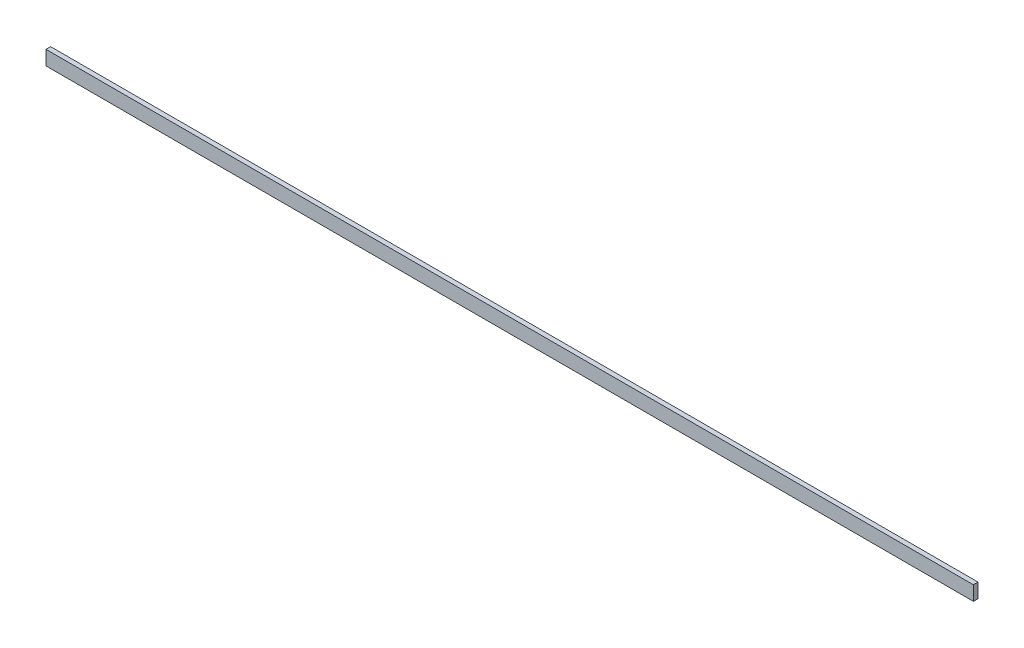
ISO-10303-21;
HEADER;
FILE_DESCRIPTION(('STEP AP214'),'2;1');
FILE_NAME('part.step','',(''),(''),'','','');
FILE_SCHEMA(('AUTOMOTIVE_DESIGN { 1 0 10303 214 1 1 1 1 }'));
ENDSEC;
DATA;
#1=APPLICATION_CONTEXT('core data for automotive mechanical design processes');
#2=APPLICATION_PROTOCOL_DEFINITION('international standard','automotive_design',2000,#1);
#3=PRODUCT_CONTEXT('',#1,'mechanical');
#4=PRODUCT('Part','Part','',(#3));
#5=PRODUCT_RELATED_PRODUCT_CATEGORY('part','',(#4));
#6=PRODUCT_DEFINITION_FORMATION('','',#4);
#7=PRODUCT_DEFINITION_CONTEXT('part definition',#1,'design');
#8=PRODUCT_DEFINITION('design','',#6,#7);
#9=PRODUCT_DEFINITION_SHAPE('','',#8);
#10=(LENGTH_UNIT() NAMED_UNIT(*) SI_UNIT(.MILLI.,.METRE.));
#11=(NAMED_UNIT(*) PLANE_ANGLE_UNIT() SI_UNIT($,.RADIAN.));
#12=(NAMED_UNIT(*) SI_UNIT($,.STERADIAN.) SOLID_ANGLE_UNIT());
#13=UNCERTAINTY_MEASURE_WITH_UNIT(LENGTH_MEASURE(1.E-05),#10,'distance_accuracy_value','');
#14=(GEOMETRIC_REPRESENTATION_CONTEXT(3) GLOBAL_UNCERTAINTY_ASSIGNED_CONTEXT((#13)) GLOBAL_UNIT_ASSIGNED_CONTEXT((#10,
#11,#12)) REPRESENTATION_CONTEXT('',''));
#15=CARTESIAN_POINT('',(0.,0.,0.));
#16=DIRECTION('',(0.,0.,1.));
#17=DIRECTION('',(1.,0.,0.));
#18=AXIS2_PLACEMENT_3D('',#15,#16,#17);
#19=CARTESIAN_POINT('',(-10.4952686825799,2.04431017119839,100.));
#20=DIRECTION('',(1.,0.,0.));
#21=DIRECTION('',(0.,1.,0.));
#22=AXIS2_PLACEMENT_3D('',#19,#20,#21);
#23=PLANE('',#22);
#24=DIRECTION('',(0.,-1.,0.));
#25=VECTOR('',#24,1.);
#26=CARTESIAN_POINT('',(-10.4952686825799,2.04431017119839,0.));
#27=LINE('',#26,#25);
#28=CARTESIAN_POINT('',(-10.4952686825799,2.04431017119839,0.));
#29=VERTEX_POINT('',#28);
#30=CARTESIAN_POINT('',(-10.4952686825798,-307.955689828802,0.));
#31=VERTEX_POINT('',#30);
#32=EDGE_CURVE('E96',#29,#31,#27,.T.);
#33=ORIENTED_EDGE('',*,*,#32,.T.);
#34=DIRECTION('',(0.,0.,-1.));
#35=VECTOR('',#34,1.);
#36=CARTESIAN_POINT('',(-10.4952686825798,-307.955689828802,100.));
#37=LINE('',#36,#35);
#38=CARTESIAN_POINT('',(-10.4952686825798,-307.955689828802,100.));
#39=VERTEX_POINT('',#38);
#40=EDGE_CURVE('E11',#39,#31,#37,.T.);
#41=ORIENTED_EDGE('',*,*,#40,.F.);
#42=DIRECTION('',(0.,-1.,0.));
#43=VECTOR('',#42,1.);
#44=CARTESIAN_POINT('',(-10.4952686825799,2.04431017119839,100.));
#45=LINE('',#44,#43);
#46=CARTESIAN_POINT('',(-10.4952686825799,2.04431017119839,100.));
#47=VERTEX_POINT('',#46);
#48=EDGE_CURVE('E84',#47,#39,#45,.T.);
#49=ORIENTED_EDGE('',*,*,#48,.F.);
#50=DIRECTION('',(0.,0.,-1.));
#51=VECTOR('',#50,1.);
#52=CARTESIAN_POINT('',(-10.4952686825799,2.04431017119839,100.));
#53=LINE('',#52,#51);
#54=EDGE_CURVE('E92',#47,#29,#53,.T.);
#55=ORIENTED_EDGE('',*,*,#54,.T.);
#56=EDGE_LOOP('',(#33,#41,#49,#55));
#57=FACE_BOUND('',#56,.T.);
#58=ADVANCED_FACE('F33',(#57),#23,.F.);
#59=CARTESIAN_POINT('',(-10.4952686825798,-307.955689828802,100.));
#60=DIRECTION('',(0.,1.,0.));
#61=DIRECTION('',(0.,0.,1.));
#62=AXIS2_PLACEMENT_3D('',#59,#60,#61);
#63=PLANE('',#62);
#64=DIRECTION('',(1.,0.,0.));
#65=VECTOR('',#64,1.);
#66=CARTESIAN_POINT('',(-10.4952686825798,-307.955689828802,0.));
#67=LINE('',#66,#65);
#68=CARTESIAN_POINT('',(19989.5047313174,-307.955689828802,0.));
#69=VERTEX_POINT('',#68);
#70=EDGE_CURVE('E88',#31,#69,#67,.T.);
#71=ORIENTED_EDGE('',*,*,#70,.T.);
#72=DIRECTION('',(0.,0.,-1.));
#73=VECTOR('',#72,1.);
#74=CARTESIAN_POINT('',(19989.5047313174,-307.955689828802,100.));
#75=LINE('',#74,#73);
#76=CARTESIAN_POINT('',(19989.5047313174,-307.955689828802,100.));
#77=VERTEX_POINT('',#76);
#78=EDGE_CURVE('E41',#77,#69,#75,.T.);
#79=ORIENTED_EDGE('',*,*,#78,.F.);
#80=DIRECTION('',(1.,0.,0.));
#81=VECTOR('',#80,1.);
#82=CARTESIAN_POINT('',(-10.4952686825798,-307.955689828802,100.));
#83=LINE('',#82,#81);
#84=EDGE_CURVE('E79',#39,#77,#83,.T.);
#85=ORIENTED_EDGE('',*,*,#84,.F.);
#86=ORIENTED_EDGE('',*,*,#40,.T.);
#87=EDGE_LOOP('',(#71,#79,#85,#86));
#88=FACE_BOUND('',#87,.T.);
#89=ADVANCED_FACE('F87',(#88),#63,.F.);
#90=CARTESIAN_POINT('',(19989.5047313174,2.04431017119839,100.));
#91=DIRECTION('',(-1.,0.,0.));
#92=DIRECTION('',(0.,0.,1.));
#93=AXIS2_PLACEMENT_3D('',#90,#91,#92);
#94=PLANE('',#93);
#95=DIRECTION('',(0.,1.,0.));
#96=VECTOR('',#95,1.);
#97=CARTESIAN_POINT('',(19989.5047313174,2.04431017119839,0.));
#98=LINE('',#97,#96);
#99=CARTESIAN_POINT('',(19989.5047313174,2.04431017119839,0.));
#100=VERTEX_POINT('',#99);
#101=EDGE_CURVE('E66',#69,#100,#98,.T.);
#102=ORIENTED_EDGE('',*,*,#101,.T.);
#103=DIRECTION('',(0.,0.,-1.));
#104=VECTOR('',#103,1.);
#105=CARTESIAN_POINT('',(19989.5047313174,2.04431017119839,100.));
#106=LINE('',#105,#104);
#107=CARTESIAN_POINT('',(19989.5047313174,2.04431017119839,100.));
#108=VERTEX_POINT('',#107);
#109=EDGE_CURVE('E89',#108,#100,#106,.T.);
#110=ORIENTED_EDGE('',*,*,#109,.F.);
#111=DIRECTION('',(0.,1.,0.));
#112=VECTOR('',#111,1.);
#113=CARTESIAN_POINT('',(19989.5047313174,2.04431017119839,100.));
#114=LINE('',#113,#112);
#115=EDGE_CURVE('E82',#77,#108,#114,.T.);
#116=ORIENTED_EDGE('',*,*,#115,.F.);
#117=ORIENTED_EDGE('',*,*,#78,.T.);
#118=EDGE_LOOP('',(#102,#110,#116,#117));
#119=FACE_BOUND('',#118,.T.);
#120=ADVANCED_FACE('F90',(#119),#94,.F.);
#121=CARTESIAN_POINT('',(-10.4952686825799,2.04431017119839,100.));
#122=DIRECTION('',(0.,-1.,0.));
#123=DIRECTION('',(0.,0.,-1.));
#124=AXIS2_PLACEMENT_3D('',#121,#122,#123);
#125=PLANE('',#124);
#126=DIRECTION('',(-1.,0.,0.));
#127=VECTOR('',#126,1.);
#128=CARTESIAN_POINT('',(-10.4952686825799,2.04431017119839,0.));
#129=LINE('',#128,#127);
#130=EDGE_CURVE('E72',#100,#29,#129,.T.);
#131=ORIENTED_EDGE('',*,*,#130,.T.);
#132=ORIENTED_EDGE('',*,*,#54,.F.);
#133=DIRECTION('',(-1.,0.,0.));
#134=VECTOR('',#133,1.);
#135=CARTESIAN_POINT('',(-10.4952686825799,2.04431017119839,100.));
#136=LINE('',#135,#134);
#137=EDGE_CURVE('E49',#108,#47,#136,.T.);
#138=ORIENTED_EDGE('',*,*,#137,.F.);
#139=ORIENTED_EDGE('',*,*,#109,.T.);
#140=EDGE_LOOP('',(#131,#132,#138,#139));
#141=FACE_BOUND('',#140,.T.);
#142=ADVANCED_FACE('F103',(#141),#125,.F.);
#143=CARTESIAN_POINT('',(0.,0.,100.));
#144=DIRECTION('',(0.,0.,1.));
#145=DIRECTION('',(1.,0.,0.));
#146=AXIS2_PLACEMENT_3D('',#143,#144,#145);
#147=PLANE('',#146);
#148=ORIENTED_EDGE('',*,*,#48,.T.);
#149=ORIENTED_EDGE('',*,*,#84,.T.);
#150=ORIENTED_EDGE('',*,*,#115,.T.);
#151=ORIENTED_EDGE('',*,*,#137,.T.);
#152=EDGE_LOOP('',(#148,#149,#150,#151));
#153=FACE_BOUND('',#152,.T.);
#154=ADVANCED_FACE('F80',(#153),#147,.T.);
#155=CARTESIAN_POINT('',(0.,0.,0.));
#156=DIRECTION('',(0.,0.,1.));
#157=DIRECTION('',(1.,0.,0.));
#158=AXIS2_PLACEMENT_3D('',#155,#156,#157);
#159=PLANE('',#158);
#160=ORIENTED_EDGE('',*,*,#32,.F.);
#161=ORIENTED_EDGE('',*,*,#130,.F.);
#162=ORIENTED_EDGE('',*,*,#101,.F.);
#163=ORIENTED_EDGE('',*,*,#70,.F.);
#164=EDGE_LOOP('',(#160,#161,#162,#163));
#165=FACE_BOUND('',#164,.T.);
#166=ADVANCED_FACE('F106',(#165),#159,.F.);
#167=CLOSED_SHELL('',(#58,#89,#120,#142,#154,#166));
#168=MANIFOLD_SOLID_BREP('B2',#167);
#169=ADVANCED_BREP_SHAPE_REPRESENTATION('',(#18,#168),#14);
#170=SHAPE_DEFINITION_REPRESENTATION(#9,#169);
ENDSEC;
END-ISO-10303-21;
